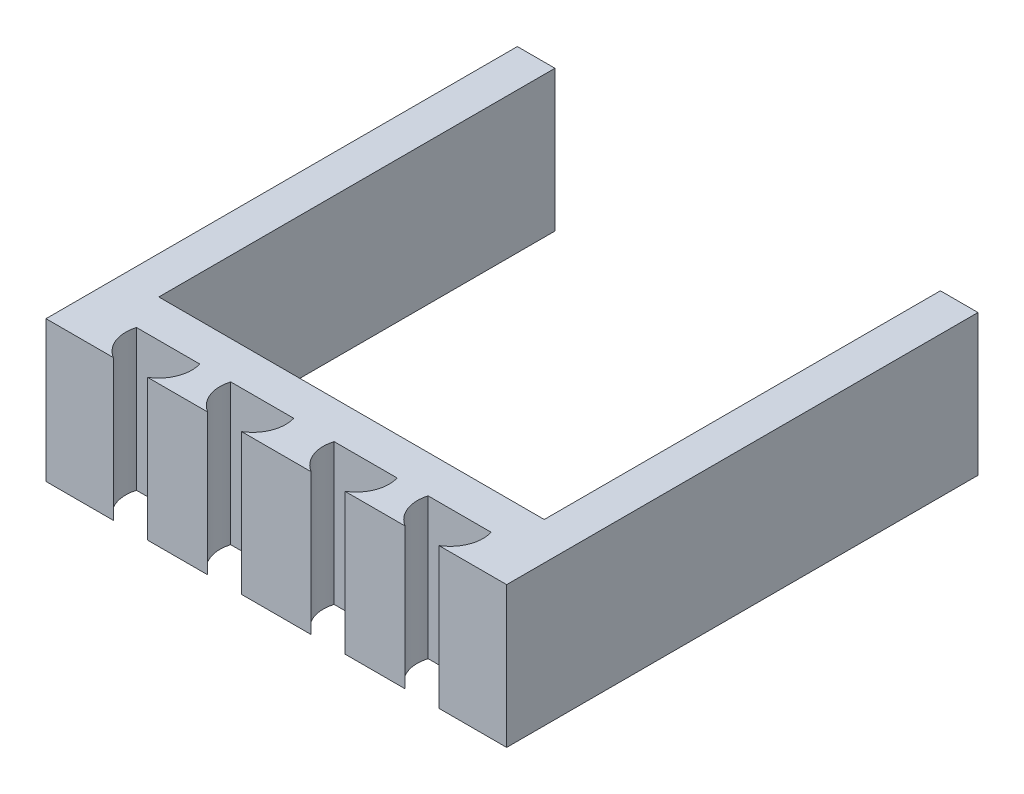
ISO-10303-21;
HEADER;
FILE_DESCRIPTION(('STEP AP214'),'2;1');
FILE_NAME('part.step','',(''),(''),'','','');
FILE_SCHEMA(('AUTOMOTIVE_DESIGN { 1 0 10303 214 1 1 1 1 }'));
ENDSEC;
DATA;
#1=APPLICATION_CONTEXT('core data for automotive mechanical design processes');
#2=APPLICATION_PROTOCOL_DEFINITION('international standard','automotive_design',2000,#1);
#3=PRODUCT_CONTEXT('',#1,'mechanical');
#4=PRODUCT('Part','Part','',(#3));
#5=PRODUCT_RELATED_PRODUCT_CATEGORY('part','',(#4));
#6=PRODUCT_DEFINITION_FORMATION('','',#4);
#7=PRODUCT_DEFINITION_CONTEXT('part definition',#1,'design');
#8=PRODUCT_DEFINITION('design','',#6,#7);
#9=PRODUCT_DEFINITION_SHAPE('','',#8);
#10=(LENGTH_UNIT() NAMED_UNIT(*) SI_UNIT(.MILLI.,.METRE.));
#11=(NAMED_UNIT(*) PLANE_ANGLE_UNIT() SI_UNIT($,.RADIAN.));
#12=(NAMED_UNIT(*) SI_UNIT($,.STERADIAN.) SOLID_ANGLE_UNIT());
#13=UNCERTAINTY_MEASURE_WITH_UNIT(LENGTH_MEASURE(1.E-05),#10,'distance_accuracy_value','');
#14=(GEOMETRIC_REPRESENTATION_CONTEXT(3) GLOBAL_UNCERTAINTY_ASSIGNED_CONTEXT((#13)) GLOBAL_UNIT_ASSIGNED_CONTEXT((#10,
#11,#12)) REPRESENTATION_CONTEXT('',''));
#15=CARTESIAN_POINT('',(0.,0.,0.));
#16=DIRECTION('',(0.,0.,1.));
#17=DIRECTION('',(1.,0.,0.));
#18=AXIS2_PLACEMENT_3D('',#15,#16,#17);
#19=CARTESIAN_POINT('',(24.3573085846868,15.,28.1102088167053));
#20=DIRECTION('',(0.,0.,-1.));
#21=DIRECTION('',(-1.,0.,0.));
#22=AXIS2_PLACEMENT_3D('',#19,#20,#21);
#23=PLANE('',#22);
#24=DIRECTION('',(1.,0.,0.));
#25=VECTOR('',#24,1.);
#26=CARTESIAN_POINT('',(24.3573085846868,0.,28.1102088167053));
#27=LINE('',#26,#25);
#28=CARTESIAN_POINT('',(2.00320661843708,0.,28.1102088167053));
#29=VERTEX_POINT('',#28);
#30=CARTESIAN_POINT('',(8.71141055093645,0.,28.1102088167053));
#31=VERTEX_POINT('',#30);
#32=EDGE_CURVE('E505',#29,#31,#27,.T.);
#33=ORIENTED_EDGE('',*,*,#32,.T.);
#34=DIRECTION('',(0.,-1.,0.));
#35=VECTOR('',#34,1.);
#36=CARTESIAN_POINT('',(8.71141055093645,15.,28.1102088167053));
#37=LINE('',#36,#35);
#38=CARTESIAN_POINT('',(8.71141055093645,15.,28.1102088167053));
#39=VERTEX_POINT('',#38);
#40=EDGE_CURVE('E293',#31,#39,#37,.F.);
#41=ORIENTED_EDGE('',*,*,#40,.T.);
#42=DIRECTION('',(1.,0.,0.));
#43=VECTOR('',#42,1.);
#44=CARTESIAN_POINT('',(24.3573085846868,15.,28.1102088167053));
#45=LINE('',#44,#43);
#46=CARTESIAN_POINT('',(2.00320661843708,15.,28.1102088167053));
#47=VERTEX_POINT('',#46);
#48=EDGE_CURVE('E482',#47,#39,#45,.T.);
#49=ORIENTED_EDGE('',*,*,#48,.F.);
#50=DIRECTION('',(0.,-1.,0.));
#51=VECTOR('',#50,1.);
#52=CARTESIAN_POINT('',(2.00320661843708,15.,28.1102088167053));
#53=LINE('',#52,#51);
#54=EDGE_CURVE('E334',#47,#29,#53,.T.);
#55=ORIENTED_EDGE('',*,*,#54,.T.);
#56=EDGE_LOOP('',(#33,#41,#49,#55));
#57=FACE_BOUND('',#56,.T.);
#58=ADVANCED_FACE('F39',(#57),#23,.F.);
#59=CARTESIAN_POINT('',(-8.99679338156291,0.,28.1102088167053));
#60=VERTEX_POINT('',#59);
#61=CARTESIAN_POINT('',(-2.28858944906354,0.,28.1102088167053));
#62=VERTEX_POINT('',#61);
#63=EDGE_CURVE('E416',#60,#62,#27,.T.);
#64=ORIENTED_EDGE('',*,*,#63,.T.);
#65=DIRECTION('',(0.,-1.,0.));
#66=VECTOR('',#65,1.);
#67=CARTESIAN_POINT('',(-2.28858944906355,15.,28.1102088167053));
#68=LINE('',#67,#66);
#69=CARTESIAN_POINT('',(-2.28858944906354,15.,28.1102088167053));
#70=VERTEX_POINT('',#69);
#71=EDGE_CURVE('E316',#70,#62,#68,.T.);
#72=ORIENTED_EDGE('',*,*,#71,.F.);
#73=CARTESIAN_POINT('',(-8.99679338156291,15.,28.1102088167053));
#74=VERTEX_POINT('',#73);
#75=EDGE_CURVE('E389',#74,#70,#45,.T.);
#76=ORIENTED_EDGE('',*,*,#75,.F.);
#77=DIRECTION('',(0.,-1.,0.));
#78=VECTOR('',#77,1.);
#79=CARTESIAN_POINT('',(-8.99679338156291,15.,28.1102088167053));
#80=LINE('',#79,#78);
#81=EDGE_CURVE('E365',#74,#60,#80,.T.);
#82=ORIENTED_EDGE('',*,*,#81,.T.);
#83=EDGE_LOOP('',(#64,#72,#76,#82));
#84=FACE_BOUND('',#83,.T.);
#85=ADVANCED_FACE('F521',(#84),#23,.F.);
#86=CARTESIAN_POINT('',(-19.0189296038567,15.,28.1102088167053));
#87=VERTEX_POINT('',#86);
#88=CARTESIAN_POINT('',(-12.2885894490635,15.,28.1102088167053));
#89=VERTEX_POINT('',#88);
#90=EDGE_CURVE('E55',#87,#89,#45,.T.);
#91=ORIENTED_EDGE('',*,*,#90,.F.);
#92=DIRECTION('',(0.,-1.,0.));
#93=VECTOR('',#92,1.);
#94=CARTESIAN_POINT('',(-19.0189296038567,15.,28.1102088167053));
#95=LINE('',#94,#93);
#96=CARTESIAN_POINT('',(-19.0189296038567,0.,28.1102088167053));
#97=VERTEX_POINT('',#96);
#98=EDGE_CURVE('E215',#87,#97,#95,.T.);
#99=ORIENTED_EDGE('',*,*,#98,.T.);
#100=CARTESIAN_POINT('',(-12.2885894490635,0.,28.1102088167053));
#101=VERTEX_POINT('',#100);
#102=EDGE_CURVE('E412',#97,#101,#27,.T.);
#103=ORIENTED_EDGE('',*,*,#102,.T.);
#104=DIRECTION('',(0.,-1.,0.));
#105=VECTOR('',#104,1.);
#106=CARTESIAN_POINT('',(-12.2885894490635,15.,28.1102088167053));
#107=LINE('',#106,#105);
#108=EDGE_CURVE('E370',#89,#101,#107,.T.);
#109=ORIENTED_EDGE('',*,*,#108,.F.);
#110=EDGE_LOOP('',(#91,#99,#103,#109));
#111=FACE_BOUND('',#110,.T.);
#112=ADVANCED_FACE('F531',(#111),#23,.F.);
#113=CARTESIAN_POINT('',(-24.6426914153132,15.,-18.0266821345708));
#114=DIRECTION('',(0.,0.,1.));
#115=DIRECTION('',(1.,0.,0.));
#116=AXIS2_PLACEMENT_3D('',#113,#114,#115);
#117=PLANE('',#116);
#118=DIRECTION('',(-1.,0.,0.));
#119=VECTOR('',#118,1.);
#120=CARTESIAN_POINT('',(-24.6426914153132,0.,-18.0266821345708));
#121=LINE('',#120,#119);
#122=CARTESIAN_POINT('',(-20.6426914153132,0.,-18.0266821345708));
#123=VERTEX_POINT('',#122);
#124=CARTESIAN_POINT('',(-24.6426914153132,0.,-18.0266821345708));
#125=VERTEX_POINT('',#124);
#126=EDGE_CURVE('E369',#123,#125,#121,.T.);
#127=ORIENTED_EDGE('',*,*,#126,.T.);
#128=DIRECTION('',(0.,-1.,0.));
#129=VECTOR('',#128,1.);
#130=CARTESIAN_POINT('',(-24.6426914153132,15.,-18.0266821345708));
#131=LINE('',#130,#129);
#132=CARTESIAN_POINT('',(-24.6426914153132,15.,-18.0266821345708));
#133=VERTEX_POINT('',#132);
#134=EDGE_CURVE('E11',#133,#125,#131,.T.);
#135=ORIENTED_EDGE('',*,*,#134,.F.);
#136=DIRECTION('',(-1.,0.,0.));
#137=VECTOR('',#136,1.);
#138=CARTESIAN_POINT('',(-24.6426914153132,15.,-18.0266821345708));
#139=LINE('',#138,#137);
#140=CARTESIAN_POINT('',(-20.6426914153132,15.,-18.0266821345708));
#141=VERTEX_POINT('',#140);
#142=EDGE_CURVE('E379',#141,#133,#139,.T.);
#143=ORIENTED_EDGE('',*,*,#142,.F.);
#144=DIRECTION('',(0.,-1.,0.));
#145=VECTOR('',#144,1.);
#146=CARTESIAN_POINT('',(-20.6426914153132,15.,-18.0266821345708));
#147=LINE('',#146,#145);
#148=EDGE_CURVE('E404',#141,#123,#147,.T.);
#149=ORIENTED_EDGE('',*,*,#148,.T.);
#150=EDGE_LOOP('',(#127,#135,#143,#149));
#151=FACE_BOUND('',#150,.T.);
#152=ADVANCED_FACE('F41',(#151),#117,.F.);
#153=CARTESIAN_POINT('',(-24.6426914153132,15.,28.1102088167053));
#154=DIRECTION('',(1.,0.,0.));
#155=DIRECTION('',(0.,0.,-1.));
#156=AXIS2_PLACEMENT_3D('',#153,#154,#155);
#157=PLANE('',#156);
#158=DIRECTION('',(0.,0.,1.));
#159=VECTOR('',#158,1.);
#160=CARTESIAN_POINT('',(-24.6426914153132,0.,28.1102088167053));
#161=LINE('',#160,#159);
#162=CARTESIAN_POINT('',(-24.6426914153132,0.,32.1102088167053));
#163=VERTEX_POINT('',#162);
#164=EDGE_CURVE('E408',#125,#163,#161,.T.);
#165=ORIENTED_EDGE('',*,*,#164,.T.);
#166=DIRECTION('',(0.,-1.,0.));
#167=VECTOR('',#166,1.);
#168=CARTESIAN_POINT('',(-24.6426914153132,15.,32.1102088167053));
#169=LINE('',#168,#167);
#170=CARTESIAN_POINT('',(-24.6426914153132,15.,32.1102088167053));
#171=VERTEX_POINT('',#170);
#172=EDGE_CURVE('E214',#171,#163,#169,.T.);
#173=ORIENTED_EDGE('',*,*,#172,.F.);
#174=DIRECTION('',(0.,0.,1.));
#175=VECTOR('',#174,1.);
#176=CARTESIAN_POINT('',(-24.6426914153132,15.,28.1102088167053));
#177=LINE('',#176,#175);
#178=EDGE_CURVE('E223',#133,#171,#177,.T.);
#179=ORIENTED_EDGE('',*,*,#178,.F.);
#180=ORIENTED_EDGE('',*,*,#134,.T.);
#181=EDGE_LOOP('',(#165,#173,#179,#180));
#182=FACE_BOUND('',#181,.T.);
#183=ADVANCED_FACE('F538',(#182),#157,.F.);
#184=CARTESIAN_POINT('',(12.0032066184371,0.,28.1102088167053));
#185=VERTEX_POINT('',#184);
#186=CARTESIAN_POINT('',(18.7114105509365,0.,28.1102088167053));
#187=VERTEX_POINT('',#186);
#188=EDGE_CURVE('E411',#185,#187,#27,.T.);
#189=ORIENTED_EDGE('',*,*,#188,.T.);
#190=DIRECTION('',(0.,-1.,0.));
#191=VECTOR('',#190,1.);
#192=CARTESIAN_POINT('',(18.7114105509365,15.,28.1102088167053));
#193=LINE('',#192,#191);
#194=CARTESIAN_POINT('',(18.7114105509365,15.,28.1102088167053));
#195=VERTEX_POINT('',#194);
#196=EDGE_CURVE('E63',#195,#187,#193,.T.);
#197=ORIENTED_EDGE('',*,*,#196,.F.);
#198=CARTESIAN_POINT('',(12.0032066186796,15.,28.1102088167056));
#199=VERTEX_POINT('',#198);
#200=EDGE_CURVE('E385',#199,#195,#45,.T.);
#201=ORIENTED_EDGE('',*,*,#200,.F.);
#202=DIRECTION('',(0.,-1.,0.));
#203=VECTOR('',#202,1.);
#204=CARTESIAN_POINT('',(12.0032066184371,15.,28.1102088167053));
#205=LINE('',#204,#203);
#206=EDGE_CURVE('E279',#199,#185,#205,.T.);
#207=ORIENTED_EDGE('',*,*,#206,.T.);
#208=EDGE_LOOP('',(#189,#197,#201,#207));
#209=FACE_BOUND('',#208,.T.);
#210=ADVANCED_FACE('F516',(#209),#23,.F.);
#211=CARTESIAN_POINT('',(24.3573085846868,15.,-18.0266821345708));
#212=DIRECTION('',(-1.,0.,0.));
#213=DIRECTION('',(0.,0.,1.));
#214=AXIS2_PLACEMENT_3D('',#211,#212,#213);
#215=PLANE('',#214);
#216=DIRECTION('',(0.,0.,-1.));
#217=VECTOR('',#216,1.);
#218=CARTESIAN_POINT('',(24.3573085846868,0.,-18.0266821345708));
#219=LINE('',#218,#217);
#220=CARTESIAN_POINT('',(24.3573085846868,0.,32.1102088167053));
#221=VERTEX_POINT('',#220);
#222=CARTESIAN_POINT('',(24.3573085846868,0.,-18.0266821345708));
#223=VERTEX_POINT('',#222);
#224=EDGE_CURVE('E415',#221,#223,#219,.T.);
#225=ORIENTED_EDGE('',*,*,#224,.T.);
#226=DIRECTION('',(0.,-1.,0.));
#227=VECTOR('',#226,1.);
#228=CARTESIAN_POINT('',(24.3573085846868,15.,-18.0266821345708));
#229=LINE('',#228,#227);
#230=CARTESIAN_POINT('',(24.3573085846868,15.,-18.0266821345708));
#231=VERTEX_POINT('',#230);
#232=EDGE_CURVE('E48',#231,#223,#229,.T.);
#233=ORIENTED_EDGE('',*,*,#232,.F.);
#234=DIRECTION('',(0.,0.,-1.));
#235=VECTOR('',#234,1.);
#236=CARTESIAN_POINT('',(24.3573085846868,15.,-18.0266821345708));
#237=LINE('',#236,#235);
#238=CARTESIAN_POINT('',(24.3573085846868,15.,32.1102088167053));
#239=VERTEX_POINT('',#238);
#240=EDGE_CURVE('E388',#239,#231,#237,.T.);
#241=ORIENTED_EDGE('',*,*,#240,.F.);
#242=DIRECTION('',(0.,-1.,0.));
#243=VECTOR('',#242,1.);
#244=CARTESIAN_POINT('',(24.3573085846868,15.,32.1102088167053));
#245=LINE('',#244,#243);
#246=EDGE_CURVE('E260',#239,#221,#245,.T.);
#247=ORIENTED_EDGE('',*,*,#246,.T.);
#248=EDGE_LOOP('',(#225,#233,#241,#247));
#249=FACE_BOUND('',#248,.T.);
#250=ADVANCED_FACE('F471',(#249),#215,.F.);
#251=CARTESIAN_POINT('',(20.3573085846868,15.,-18.0266821345708));
#252=DIRECTION('',(0.,0.,1.));
#253=DIRECTION('',(1.,0.,0.));
#254=AXIS2_PLACEMENT_3D('',#251,#252,#253);
#255=PLANE('',#254);
#256=DIRECTION('',(-1.,0.,0.));
#257=VECTOR('',#256,1.);
#258=CARTESIAN_POINT('',(20.3573085846868,0.,-18.0266821345708));
#259=LINE('',#258,#257);
#260=CARTESIAN_POINT('',(20.3573085846868,0.,-18.0266821345708));
#261=VERTEX_POINT('',#260);
#262=EDGE_CURVE('E419',#223,#261,#259,.T.);
#263=ORIENTED_EDGE('',*,*,#262,.T.);
#264=DIRECTION('',(0.,-1.,0.));
#265=VECTOR('',#264,1.);
#266=CARTESIAN_POINT('',(20.3573085846868,15.,-18.0266821345708));
#267=LINE('',#266,#265);
#268=CARTESIAN_POINT('',(20.3573085846868,15.,-18.0266821345708));
#269=VERTEX_POINT('',#268);
#270=EDGE_CURVE('E441',#269,#261,#267,.T.);
#271=ORIENTED_EDGE('',*,*,#270,.F.);
#272=DIRECTION('',(-1.,0.,0.));
#273=VECTOR('',#272,1.);
#274=CARTESIAN_POINT('',(20.3573085846868,15.,-18.0266821345708));
#275=LINE('',#274,#273);
#276=EDGE_CURVE('E392',#231,#269,#275,.T.);
#277=ORIENTED_EDGE('',*,*,#276,.F.);
#278=ORIENTED_EDGE('',*,*,#232,.T.);
#279=EDGE_LOOP('',(#263,#271,#277,#278));
#280=FACE_BOUND('',#279,.T.);
#281=ADVANCED_FACE('F450',(#280),#255,.F.);
#282=CARTESIAN_POINT('',(20.3573085846868,15.,24.1102088167053));
#283=DIRECTION('',(1.,0.,0.));
#284=DIRECTION('',(0.,0.,-1.));
#285=AXIS2_PLACEMENT_3D('',#282,#283,#284);
#286=PLANE('',#285);
#287=DIRECTION('',(0.,0.,1.));
#288=VECTOR('',#287,1.);
#289=CARTESIAN_POINT('',(20.3573085846868,0.,24.1102088167053));
#290=LINE('',#289,#288);
#291=CARTESIAN_POINT('',(20.3573085846868,0.,24.1102088167053));
#292=VERTEX_POINT('',#291);
#293=EDGE_CURVE('E422',#261,#292,#290,.T.);
#294=ORIENTED_EDGE('',*,*,#293,.T.);
#295=DIRECTION('',(0.,-1.,0.));
#296=VECTOR('',#295,1.);
#297=CARTESIAN_POINT('',(20.3573085846868,15.,24.1102088167053));
#298=LINE('',#297,#296);
#299=CARTESIAN_POINT('',(20.3573085846868,15.,24.1102088167053));
#300=VERTEX_POINT('',#299);
#301=EDGE_CURVE('E437',#300,#292,#298,.T.);
#302=ORIENTED_EDGE('',*,*,#301,.F.);
#303=DIRECTION('',(0.,0.,1.));
#304=VECTOR('',#303,1.);
#305=CARTESIAN_POINT('',(20.3573085846868,15.,24.1102088167053));
#306=LINE('',#305,#304);
#307=EDGE_CURVE('E395',#269,#300,#306,.T.);
#308=ORIENTED_EDGE('',*,*,#307,.F.);
#309=ORIENTED_EDGE('',*,*,#270,.T.);
#310=EDGE_LOOP('',(#294,#302,#308,#309));
#311=FACE_BOUND('',#310,.T.);
#312=ADVANCED_FACE('F460',(#311),#286,.F.);
#313=CARTESIAN_POINT('',(-20.6426914153132,15.,24.1102088167053));
#314=DIRECTION('',(0.,0.,1.));
#315=DIRECTION('',(1.,0.,0.));
#316=AXIS2_PLACEMENT_3D('',#313,#314,#315);
#317=PLANE('',#316);
#318=DIRECTION('',(-1.,0.,0.));
#319=VECTOR('',#318,1.);
#320=CARTESIAN_POINT('',(-20.6426914153132,0.,24.1102088167053));
#321=LINE('',#320,#319);
#322=CARTESIAN_POINT('',(-20.6426914153132,0.,24.1102088167053));
#323=VERTEX_POINT('',#322);
#324=EDGE_CURVE('E425',#292,#323,#321,.T.);
#325=ORIENTED_EDGE('',*,*,#324,.T.);
#326=DIRECTION('',(0.,-1.,0.));
#327=VECTOR('',#326,1.);
#328=CARTESIAN_POINT('',(-20.6426914153132,15.,24.1102088167053));
#329=LINE('',#328,#327);
#330=CARTESIAN_POINT('',(-20.6426914153132,15.,24.1102088167053));
#331=VERTEX_POINT('',#330);
#332=EDGE_CURVE('E433',#331,#323,#329,.T.);
#333=ORIENTED_EDGE('',*,*,#332,.F.);
#334=DIRECTION('',(-1.,0.,0.));
#335=VECTOR('',#334,1.);
#336=CARTESIAN_POINT('',(-20.6426914153132,15.,24.1102088167053));
#337=LINE('',#336,#335);
#338=EDGE_CURVE('E398',#300,#331,#337,.T.);
#339=ORIENTED_EDGE('',*,*,#338,.F.);
#340=ORIENTED_EDGE('',*,*,#301,.T.);
#341=EDGE_LOOP('',(#325,#333,#339,#340));
#342=FACE_BOUND('',#341,.T.);
#343=ADVANCED_FACE('F464',(#342),#317,.F.);
#344=CARTESIAN_POINT('',(-20.6426914153132,15.,-18.0266821345708));
#345=DIRECTION('',(-1.,0.,0.));
#346=DIRECTION('',(0.,0.,1.));
#347=AXIS2_PLACEMENT_3D('',#344,#345,#346);
#348=PLANE('',#347);
#349=DIRECTION('',(0.,0.,-1.));
#350=VECTOR('',#349,1.);
#351=CARTESIAN_POINT('',(-20.6426914153132,0.,-18.0266821345708));
#352=LINE('',#351,#350);
#353=EDGE_CURVE('E382',#323,#123,#352,.T.);
#354=ORIENTED_EDGE('',*,*,#353,.T.);
#355=ORIENTED_EDGE('',*,*,#148,.F.);
#356=DIRECTION('',(0.,0.,-1.));
#357=VECTOR('',#356,1.);
#358=CARTESIAN_POINT('',(-20.6426914153132,15.,-18.0266821345708));
#359=LINE('',#358,#357);
#360=EDGE_CURVE('E401',#331,#141,#359,.T.);
#361=ORIENTED_EDGE('',*,*,#360,.F.);
#362=ORIENTED_EDGE('',*,*,#332,.T.);
#363=EDGE_LOOP('',(#354,#355,#361,#362));
#364=FACE_BOUND('',#363,.T.);
#365=ADVANCED_FACE('F589',(#364),#348,.F.);
#366=CARTESIAN_POINT('',(0.,15.,0.));
#367=DIRECTION('',(0.,-1.,0.));
#368=DIRECTION('',(0.,0.,-1.));
#369=AXIS2_PLACEMENT_3D('',#366,#367,#368);
#370=PLANE('',#369);
#371=ORIENTED_EDGE('',*,*,#48,.T.);
#372=CARTESIAN_POINT('',(5.35730858468677,15.,29.1102088167053));
#373=DIRECTION('',(0.,1.,0.));
#374=DIRECTION('',(0.,0.,1.));
#375=AXIS2_PLACEMENT_3D('',#372,#373,#374);
#376=CIRCLE('',#375,3.5);
#377=CARTESIAN_POINT('',(7.16008422241877,15.,32.1102088167053));
#378=VERTEX_POINT('',#377);
#379=EDGE_CURVE('E266',#378,#39,#376,.T.);
#380=ORIENTED_EDGE('',*,*,#379,.F.);
#381=DIRECTION('',(-1.,0.,0.));
#382=VECTOR('',#381,1.);
#383=CARTESIAN_POINT('',(7.16008422241877,15.,32.1102088167053));
#384=LINE('',#383,#382);
#385=CARTESIAN_POINT('',(13.5545329469548,15.,32.1102088167053));
#386=VERTEX_POINT('',#385);
#387=EDGE_CURVE('E275',#386,#378,#384,.T.);
#388=ORIENTED_EDGE('',*,*,#387,.F.);
#389=CARTESIAN_POINT('',(15.3573085846868,15.,29.1102088167053));
#390=DIRECTION('',(0.,1.,0.));
#391=DIRECTION('',(0.,0.,1.));
#392=AXIS2_PLACEMENT_3D('',#389,#390,#391);
#393=CIRCLE('',#392,3.5);
#394=EDGE_CURVE('E270',#199,#386,#393,.T.);
#395=ORIENTED_EDGE('',*,*,#394,.F.);
#396=ORIENTED_EDGE('',*,*,#200,.T.);
#397=CARTESIAN_POINT('',(15.3573085846868,15.,29.1102088167053));
#398=DIRECTION('',(0.,1.,0.));
#399=DIRECTION('',(0.,0.,-1.));
#400=AXIS2_PLACEMENT_3D('',#397,#398,#399);
#401=CIRCLE('',#400,3.50000000000001);
#402=CARTESIAN_POINT('',(17.1600842224188,15.,32.1102088167053));
#403=VERTEX_POINT('',#402);
#404=EDGE_CURVE('E241',#403,#195,#401,.T.);
#405=ORIENTED_EDGE('',*,*,#404,.F.);
#406=DIRECTION('',(-1.,0.,0.));
#407=VECTOR('',#406,1.);
#408=CARTESIAN_POINT('',(17.1600842224188,15.,32.1102088167053));
#409=LINE('',#408,#407);
#410=EDGE_CURVE('E245',#239,#403,#409,.T.);
#411=ORIENTED_EDGE('',*,*,#410,.F.);
#412=ORIENTED_EDGE('',*,*,#240,.T.);
#413=ORIENTED_EDGE('',*,*,#276,.T.);
#414=ORIENTED_EDGE('',*,*,#307,.T.);
#415=ORIENTED_EDGE('',*,*,#338,.T.);
#416=ORIENTED_EDGE('',*,*,#360,.T.);
#417=ORIENTED_EDGE('',*,*,#142,.T.);
#418=ORIENTED_EDGE('',*,*,#178,.T.);
#419=DIRECTION('',(-1.,0.,0.));
#420=VECTOR('',#419,1.);
#421=CARTESIAN_POINT('',(-24.6426914153132,15.,32.1102088167053));
#422=LINE('',#421,#420);
#423=CARTESIAN_POINT('',(-17.4863248674342,15.,32.1102088167053));
#424=VERTEX_POINT('',#423);
#425=EDGE_CURVE('E206',#424,#171,#422,.T.);
#426=ORIENTED_EDGE('',*,*,#425,.F.);
#427=CARTESIAN_POINT('',(-15.6426914153132,15.,29.1102088167053));
#428=DIRECTION('',(0.,1.,0.));
#429=DIRECTION('',(0.,0.,-1.));
#430=AXIS2_PLACEMENT_3D('',#427,#428,#429);
#431=CIRCLE('',#430,3.52121915049026);
#432=EDGE_CURVE('E221',#87,#424,#431,.T.);
#433=ORIENTED_EDGE('',*,*,#432,.F.);
#434=ORIENTED_EDGE('',*,*,#90,.T.);
#435=CARTESIAN_POINT('',(-15.6426914153132,15.,29.1102088167053));
#436=DIRECTION('',(0.,1.,0.));
#437=DIRECTION('',(0.,0.,1.));
#438=AXIS2_PLACEMENT_3D('',#435,#436,#437);
#439=CIRCLE('',#438,3.5);
#440=CARTESIAN_POINT('',(-13.8399157775812,15.,32.1102088167053));
#441=VERTEX_POINT('',#440);
#442=EDGE_CURVE('E350',#441,#89,#439,.T.);
#443=ORIENTED_EDGE('',*,*,#442,.F.);
#444=DIRECTION('',(-1.,0.,0.));
#445=VECTOR('',#444,1.);
#446=CARTESIAN_POINT('',(-13.8399157775812,15.,32.1102088167053));
#447=LINE('',#446,#445);
#448=CARTESIAN_POINT('',(-7.44546705304523,15.,32.1102088167053));
#449=VERTEX_POINT('',#448);
#450=EDGE_CURVE('E345',#449,#441,#447,.T.);
#451=ORIENTED_EDGE('',*,*,#450,.F.);
#452=CARTESIAN_POINT('',(-5.64269141531323,15.,29.1102088167053));
#453=DIRECTION('',(0.,1.,0.));
#454=DIRECTION('',(0.,0.,1.));
#455=AXIS2_PLACEMENT_3D('',#452,#453,#454);
#456=CIRCLE('',#455,3.5);
#457=EDGE_CURVE('E341',#74,#449,#456,.T.);
#458=ORIENTED_EDGE('',*,*,#457,.F.);
#459=ORIENTED_EDGE('',*,*,#75,.T.);
#460=CARTESIAN_POINT('',(-5.64269141531323,15.,29.1102088167053));
#461=DIRECTION('',(0.,1.,0.));
#462=DIRECTION('',(0.,0.,1.));
#463=AXIS2_PLACEMENT_3D('',#460,#461,#462);
#464=CIRCLE('',#463,3.5);
#465=CARTESIAN_POINT('',(-3.83991577758123,15.,32.1102088167053));
#466=VERTEX_POINT('',#465);
#467=EDGE_CURVE('E303',#466,#70,#464,.T.);
#468=ORIENTED_EDGE('',*,*,#467,.F.);
#469=DIRECTION('',(-1.,0.,0.));
#470=VECTOR('',#469,1.);
#471=CARTESIAN_POINT('',(-3.83991577758123,15.,32.1102088167053));
#472=LINE('',#471,#470);
#473=CARTESIAN_POINT('',(3.55453294695477,15.,32.1102088167053));
#474=VERTEX_POINT('',#473);
#475=EDGE_CURVE('E312',#474,#466,#472,.T.);
#476=ORIENTED_EDGE('',*,*,#475,.F.);
#477=CARTESIAN_POINT('',(5.35730858468677,15.,29.1102088167053));
#478=DIRECTION('',(0.,1.,0.));
#479=DIRECTION('',(0.,0.,-1.));
#480=AXIS2_PLACEMENT_3D('',#477,#478,#479);
#481=CIRCLE('',#480,3.5);
#482=EDGE_CURVE('E307',#47,#474,#481,.T.);
#483=ORIENTED_EDGE('',*,*,#482,.F.);
#484=EDGE_LOOP('',(#371,#380,#388,#395,#396,#405,#411,#412,#413,#414,#415,#416,#417,#418,#426,
#433,#434,#443,#451,#458,#459,#468,#476,#483));
#485=FACE_BOUND('',#484,.T.);
#486=ADVANCED_FACE('F220',(#485),#370,.F.);
#487=CARTESIAN_POINT('',(0.,0.,0.));
#488=DIRECTION('',(0.,-1.,0.));
#489=DIRECTION('',(0.,0.,-1.));
#490=AXIS2_PLACEMENT_3D('',#487,#488,#489);
#491=PLANE('',#490);
#492=ORIENTED_EDGE('',*,*,#188,.F.);
#493=CARTESIAN_POINT('',(15.3573085846868,0.,29.1102088167053));
#494=DIRECTION('',(0.,1.,0.));
#495=DIRECTION('',(0.,0.,1.));
#496=AXIS2_PLACEMENT_3D('',#493,#494,#495);
#497=CIRCLE('',#496,3.5);
#498=CARTESIAN_POINT('',(13.5545329469548,0.,32.1102088167053));
#499=VERTEX_POINT('',#498);
#500=EDGE_CURVE('E283',#185,#499,#497,.T.);
#501=ORIENTED_EDGE('',*,*,#500,.T.);
#502=DIRECTION('',(-1.,0.,0.));
#503=VECTOR('',#502,1.);
#504=CARTESIAN_POINT('',(7.16008422241877,0.,32.1102088167053));
#505=LINE('',#504,#503);
#506=CARTESIAN_POINT('',(7.16008422241877,0.,32.1102088167053));
#507=VERTEX_POINT('',#506);
#508=EDGE_CURVE('E271',#499,#507,#505,.T.);
#509=ORIENTED_EDGE('',*,*,#508,.T.);
#510=CARTESIAN_POINT('',(5.35730858468677,0.,29.1102088167053));
#511=DIRECTION('',(0.,1.,0.));
#512=DIRECTION('',(0.,0.,1.));
#513=AXIS2_PLACEMENT_3D('',#510,#511,#512);
#514=CIRCLE('',#513,3.5);
#515=EDGE_CURVE('E259',#507,#31,#514,.T.);
#516=ORIENTED_EDGE('',*,*,#515,.T.);
#517=ORIENTED_EDGE('',*,*,#32,.F.);
#518=CARTESIAN_POINT('',(5.35730858468677,0.,29.1102088167053));
#519=DIRECTION('',(0.,1.,0.));
#520=DIRECTION('',(0.,0.,-1.));
#521=AXIS2_PLACEMENT_3D('',#518,#519,#520);
#522=CIRCLE('',#521,3.5);
#523=CARTESIAN_POINT('',(3.55453294695477,0.,32.1102088167053));
#524=VERTEX_POINT('',#523);
#525=EDGE_CURVE('E320',#29,#524,#522,.T.);
#526=ORIENTED_EDGE('',*,*,#525,.T.);
#527=DIRECTION('',(-1.,0.,0.));
#528=VECTOR('',#527,1.);
#529=CARTESIAN_POINT('',(-3.83991577758123,0.,32.1102088167053));
#530=LINE('',#529,#528);
#531=CARTESIAN_POINT('',(-3.83991577758123,0.,32.1102088167053));
#532=VERTEX_POINT('',#531);
#533=EDGE_CURVE('E308',#524,#532,#530,.T.);
#534=ORIENTED_EDGE('',*,*,#533,.T.);
#535=CARTESIAN_POINT('',(-5.64269141531323,0.,29.1102088167053));
#536=DIRECTION('',(0.,1.,0.));
#537=DIRECTION('',(0.,0.,1.));
#538=AXIS2_PLACEMENT_3D('',#535,#536,#537);
#539=CIRCLE('',#538,3.5);
#540=EDGE_CURVE('E302',#532,#62,#539,.T.);
#541=ORIENTED_EDGE('',*,*,#540,.T.);
#542=ORIENTED_EDGE('',*,*,#63,.F.);
#543=CARTESIAN_POINT('',(-5.64269141531323,0.,29.1102088167053));
#544=DIRECTION('',(0.,1.,0.));
#545=DIRECTION('',(0.,0.,1.));
#546=AXIS2_PLACEMENT_3D('',#543,#544,#545);
#547=CIRCLE('',#546,3.5);
#548=CARTESIAN_POINT('',(-7.44546705304523,0.,32.1102088167053));
#549=VERTEX_POINT('',#548);
#550=EDGE_CURVE('E330',#60,#549,#547,.T.);
#551=ORIENTED_EDGE('',*,*,#550,.T.);
#552=DIRECTION('',(-1.,0.,0.));
#553=VECTOR('',#552,1.);
#554=CARTESIAN_POINT('',(-13.8399157775812,0.,32.1102088167053));
#555=LINE('',#554,#553);
#556=CARTESIAN_POINT('',(-13.8399157775812,0.,32.1102088167053));
#557=VERTEX_POINT('',#556);
#558=EDGE_CURVE('E358',#549,#557,#555,.T.);
#559=ORIENTED_EDGE('',*,*,#558,.T.);
#560=CARTESIAN_POINT('',(-15.6426914153132,0.,29.1102088167053));
#561=DIRECTION('',(0.,1.,0.));
#562=DIRECTION('',(0.,0.,1.));
#563=AXIS2_PLACEMENT_3D('',#560,#561,#562);
#564=CIRCLE('',#563,3.5);
#565=EDGE_CURVE('E346',#557,#101,#564,.T.);
#566=ORIENTED_EDGE('',*,*,#565,.T.);
#567=ORIENTED_EDGE('',*,*,#102,.F.);
#568=CARTESIAN_POINT('',(-15.6426914153132,0.,29.1102088167053));
#569=DIRECTION('',(0.,1.,0.));
#570=DIRECTION('',(0.,0.,-1.));
#571=AXIS2_PLACEMENT_3D('',#568,#569,#570);
#572=CIRCLE('',#571,3.52121915049026);
#573=CARTESIAN_POINT('',(-17.4863248674342,0.,32.1102088167053));
#574=VERTEX_POINT('',#573);
#575=EDGE_CURVE('E231',#97,#574,#572,.T.);
#576=ORIENTED_EDGE('',*,*,#575,.T.);
#577=DIRECTION('',(-1.,0.,0.));
#578=VECTOR('',#577,1.);
#579=CARTESIAN_POINT('',(-24.6426914153132,0.,32.1102088167053));
#580=LINE('',#579,#578);
#581=EDGE_CURVE('E208',#574,#163,#580,.T.);
#582=ORIENTED_EDGE('',*,*,#581,.T.);
#583=ORIENTED_EDGE('',*,*,#164,.F.);
#584=ORIENTED_EDGE('',*,*,#126,.F.);
#585=ORIENTED_EDGE('',*,*,#353,.F.);
#586=ORIENTED_EDGE('',*,*,#324,.F.);
#587=ORIENTED_EDGE('',*,*,#293,.F.);
#588=ORIENTED_EDGE('',*,*,#262,.F.);
#589=ORIENTED_EDGE('',*,*,#224,.F.);
#590=DIRECTION('',(-1.,0.,0.));
#591=VECTOR('',#590,1.);
#592=CARTESIAN_POINT('',(17.1600842224188,0.,32.1102088167053));
#593=LINE('',#592,#591);
#594=CARTESIAN_POINT('',(17.1600842224188,0.,32.1102088167053));
#595=VERTEX_POINT('',#594);
#596=EDGE_CURVE('E246',#221,#595,#593,.T.);
#597=ORIENTED_EDGE('',*,*,#596,.T.);
#598=CARTESIAN_POINT('',(15.3573085846868,0.,29.1102088167053));
#599=DIRECTION('',(0.,1.,0.));
#600=DIRECTION('',(0.,0.,-1.));
#601=AXIS2_PLACEMENT_3D('',#598,#599,#600);
#602=CIRCLE('',#601,3.50000000000001);
#603=EDGE_CURVE('E237',#595,#187,#602,.T.);
#604=ORIENTED_EDGE('',*,*,#603,.T.);
#605=EDGE_LOOP('',(#492,#501,#509,#516,#517,#526,#534,#541,#542,#551,#559,#566,#567,#576,#582,
#583,#584,#585,#586,#587,#588,#589,#597,#604));
#606=FACE_BOUND('',#605,.T.);
#607=ADVANCED_FACE('F455',(#606),#491,.T.);
#608=CARTESIAN_POINT('',(-5.64269141531323,15.,29.1102088167053));
#609=DIRECTION('',(0.,-1.,0.));
#610=DIRECTION('',(0.,0.,-1.));
#611=AXIS2_PLACEMENT_3D('',#608,#609,#610);
#612=CYLINDRICAL_SURFACE('',#611,3.5);
#613=ORIENTED_EDGE('',*,*,#550,.F.);
#614=ORIENTED_EDGE('',*,*,#81,.F.);
#615=ORIENTED_EDGE('',*,*,#457,.T.);
#616=DIRECTION('',(0.,-1.,0.));
#617=VECTOR('',#616,1.);
#618=CARTESIAN_POINT('',(-7.44546705304523,15.,32.1102088167053));
#619=LINE('',#618,#617);
#620=EDGE_CURVE('E354',#449,#549,#619,.T.);
#621=ORIENTED_EDGE('',*,*,#620,.T.);
#622=EDGE_LOOP('',(#613,#614,#615,#621));
#623=FACE_BOUND('',#622,.T.);
#624=ADVANCED_FACE('F524',(#623),#612,.F.);
#625=CARTESIAN_POINT('',(-15.6426914153132,15.,29.1102088167053));
#626=DIRECTION('',(0.,-1.,0.));
#627=DIRECTION('',(0.,0.,-1.));
#628=AXIS2_PLACEMENT_3D('',#625,#626,#627);
#629=CYLINDRICAL_SURFACE('',#628,3.5);
#630=ORIENTED_EDGE('',*,*,#565,.F.);
#631=DIRECTION('',(0.,-1.,0.));
#632=VECTOR('',#631,1.);
#633=CARTESIAN_POINT('',(-13.8399157775812,15.,32.1102088167053));
#634=LINE('',#633,#632);
#635=EDGE_CURVE('E374',#441,#557,#634,.T.);
#636=ORIENTED_EDGE('',*,*,#635,.F.);
#637=ORIENTED_EDGE('',*,*,#442,.T.);
#638=ORIENTED_EDGE('',*,*,#108,.T.);
#639=EDGE_LOOP('',(#630,#636,#637,#638));
#640=FACE_BOUND('',#639,.T.);
#641=ADVANCED_FACE('F530',(#640),#629,.F.);
#642=CARTESIAN_POINT('',(-13.8399157775812,15.,32.1102088167053));
#643=DIRECTION('',(0.,0.,1.));
#644=DIRECTION('',(1.,0.,0.));
#645=AXIS2_PLACEMENT_3D('',#642,#643,#644);
#646=PLANE('',#645);
#647=ORIENTED_EDGE('',*,*,#558,.F.);
#648=ORIENTED_EDGE('',*,*,#620,.F.);
#649=ORIENTED_EDGE('',*,*,#450,.T.);
#650=ORIENTED_EDGE('',*,*,#635,.T.);
#651=EDGE_LOOP('',(#647,#648,#649,#650));
#652=FACE_BOUND('',#651,.T.);
#653=ADVANCED_FACE('F526',(#652),#646,.T.);
#654=CARTESIAN_POINT('',(-5.64269141531323,15.,29.1102088167053));
#655=DIRECTION('',(0.,-1.,0.));
#656=DIRECTION('',(0.,0.,-1.));
#657=AXIS2_PLACEMENT_3D('',#654,#655,#656);
#658=CYLINDRICAL_SURFACE('',#657,3.5);
#659=ORIENTED_EDGE('',*,*,#540,.F.);
#660=DIRECTION('',(0.,-1.,0.));
#661=VECTOR('',#660,1.);
#662=CARTESIAN_POINT('',(-3.83991577758123,15.,32.1102088167053));
#663=LINE('',#662,#661);
#664=EDGE_CURVE('E327',#466,#532,#663,.T.);
#665=ORIENTED_EDGE('',*,*,#664,.F.);
#666=ORIENTED_EDGE('',*,*,#467,.T.);
#667=ORIENTED_EDGE('',*,*,#71,.T.);
#668=EDGE_LOOP('',(#659,#665,#666,#667));
#669=FACE_BOUND('',#668,.T.);
#670=ADVANCED_FACE('F496',(#669),#658,.F.);
#671=CARTESIAN_POINT('',(-3.83991577758123,15.,32.1102088167053));
#672=DIRECTION('',(0.,0.,1.));
#673=DIRECTION('',(1.,0.,0.));
#674=AXIS2_PLACEMENT_3D('',#671,#672,#673);
#675=PLANE('',#674);
#676=ORIENTED_EDGE('',*,*,#533,.F.);
#677=DIRECTION('',(0.,-1.,0.));
#678=VECTOR('',#677,1.);
#679=CARTESIAN_POINT('',(3.55453294695477,15.,32.1102088167053));
#680=LINE('',#679,#678);
#681=EDGE_CURVE('E331',#474,#524,#680,.T.);
#682=ORIENTED_EDGE('',*,*,#681,.F.);
#683=ORIENTED_EDGE('',*,*,#475,.T.);
#684=ORIENTED_EDGE('',*,*,#664,.T.);
#685=EDGE_LOOP('',(#676,#682,#683,#684));
#686=FACE_BOUND('',#685,.T.);
#687=ADVANCED_FACE('F499',(#686),#675,.T.);
#688=CARTESIAN_POINT('',(5.35730858468677,15.,29.1102088167053));
#689=DIRECTION('',(0.,-1.,0.));
#690=DIRECTION('',(0.,0.,-1.));
#691=AXIS2_PLACEMENT_3D('',#688,#689,#690);
#692=CYLINDRICAL_SURFACE('',#691,3.5);
#693=ORIENTED_EDGE('',*,*,#525,.F.);
#694=ORIENTED_EDGE('',*,*,#54,.F.);
#695=ORIENTED_EDGE('',*,*,#482,.T.);
#696=ORIENTED_EDGE('',*,*,#681,.T.);
#697=EDGE_LOOP('',(#693,#694,#695,#696));
#698=FACE_BOUND('',#697,.T.);
#699=ADVANCED_FACE('F503',(#698),#692,.F.);
#700=CARTESIAN_POINT('',(5.35730858468677,15.,29.1102088167053));
#701=DIRECTION('',(0.,-1.,0.));
#702=DIRECTION('',(0.,0.,-1.));
#703=AXIS2_PLACEMENT_3D('',#700,#701,#702);
#704=CYLINDRICAL_SURFACE('',#703,3.5);
#705=ORIENTED_EDGE('',*,*,#40,.F.);
#706=ORIENTED_EDGE('',*,*,#515,.F.);
#707=DIRECTION('',(0.,-1.,0.));
#708=VECTOR('',#707,1.);
#709=CARTESIAN_POINT('',(7.16008422241877,15.,32.1102088167053));
#710=LINE('',#709,#708);
#711=EDGE_CURVE('E290',#378,#507,#710,.T.);
#712=ORIENTED_EDGE('',*,*,#711,.F.);
#713=ORIENTED_EDGE('',*,*,#379,.T.);
#714=EDGE_LOOP('',(#705,#706,#712,#713));
#715=FACE_BOUND('',#714,.T.);
#716=ADVANCED_FACE('F509',(#715),#704,.F.);
#717=CARTESIAN_POINT('',(7.16008422241877,15.,32.1102088167053));
#718=DIRECTION('',(0.,0.,1.));
#719=DIRECTION('',(1.,0.,0.));
#720=AXIS2_PLACEMENT_3D('',#717,#718,#719);
#721=PLANE('',#720);
#722=ORIENTED_EDGE('',*,*,#508,.F.);
#723=DIRECTION('',(0.,-1.,0.));
#724=VECTOR('',#723,1.);
#725=CARTESIAN_POINT('',(13.5545329469548,15.,32.1102088167053));
#726=LINE('',#725,#724);
#727=EDGE_CURVE('E294',#386,#499,#726,.T.);
#728=ORIENTED_EDGE('',*,*,#727,.F.);
#729=ORIENTED_EDGE('',*,*,#387,.T.);
#730=ORIENTED_EDGE('',*,*,#711,.T.);
#731=EDGE_LOOP('',(#722,#728,#729,#730));
#732=FACE_BOUND('',#731,.T.);
#733=ADVANCED_FACE('F513',(#732),#721,.T.);
#734=CARTESIAN_POINT('',(15.3573085846868,15.,29.1102088167053));
#735=DIRECTION('',(0.,-1.,0.));
#736=DIRECTION('',(0.,0.,-1.));
#737=AXIS2_PLACEMENT_3D('',#734,#735,#736);
#738=CYLINDRICAL_SURFACE('',#737,3.5);
#739=ORIENTED_EDGE('',*,*,#500,.F.);
#740=ORIENTED_EDGE('',*,*,#206,.F.);
#741=ORIENTED_EDGE('',*,*,#394,.T.);
#742=ORIENTED_EDGE('',*,*,#727,.T.);
#743=EDGE_LOOP('',(#739,#740,#741,#742));
#744=FACE_BOUND('',#743,.T.);
#745=ADVANCED_FACE('F515',(#744),#738,.F.);
#746=CARTESIAN_POINT('',(15.3573085846868,15.,29.1102088167053));
#747=DIRECTION('',(0.,-1.,0.));
#748=DIRECTION('',(0.,0.,-1.));
#749=AXIS2_PLACEMENT_3D('',#746,#747,#748);
#750=CYLINDRICAL_SURFACE('',#749,3.50000000000001);
#751=ORIENTED_EDGE('',*,*,#603,.F.);
#752=DIRECTION('',(0.,-1.,0.));
#753=VECTOR('',#752,1.);
#754=CARTESIAN_POINT('',(17.1600842224188,15.,32.1102088167053));
#755=LINE('',#754,#753);
#756=EDGE_CURVE('E256',#403,#595,#755,.T.);
#757=ORIENTED_EDGE('',*,*,#756,.F.);
#758=ORIENTED_EDGE('',*,*,#404,.T.);
#759=ORIENTED_EDGE('',*,*,#196,.T.);
#760=EDGE_LOOP('',(#751,#757,#758,#759));
#761=FACE_BOUND('',#760,.T.);
#762=ADVANCED_FACE('F477',(#761),#750,.F.);
#763=CARTESIAN_POINT('',(17.1600842224188,15.,32.1102088167053));
#764=DIRECTION('',(0.,0.,1.));
#765=DIRECTION('',(1.,0.,0.));
#766=AXIS2_PLACEMENT_3D('',#763,#764,#765);
#767=PLANE('',#766);
#768=ORIENTED_EDGE('',*,*,#596,.F.);
#769=ORIENTED_EDGE('',*,*,#246,.F.);
#770=ORIENTED_EDGE('',*,*,#410,.T.);
#771=ORIENTED_EDGE('',*,*,#756,.T.);
#772=EDGE_LOOP('',(#768,#769,#770,#771));
#773=FACE_BOUND('',#772,.T.);
#774=ADVANCED_FACE('F474',(#773),#767,.T.);
#775=CARTESIAN_POINT('',(-24.6426914153132,15.,32.1102088167053));
#776=DIRECTION('',(0.,0.,1.));
#777=DIRECTION('',(1.,0.,0.));
#778=AXIS2_PLACEMENT_3D('',#775,#776,#777);
#779=PLANE('',#778);
#780=ORIENTED_EDGE('',*,*,#581,.F.);
#781=DIRECTION('',(0.,-1.,0.));
#782=VECTOR('',#781,1.);
#783=CARTESIAN_POINT('',(-17.4863248674342,15.,32.1102088167053));
#784=LINE('',#783,#782);
#785=EDGE_CURVE('E202',#424,#574,#784,.T.);
#786=ORIENTED_EDGE('',*,*,#785,.F.);
#787=ORIENTED_EDGE('',*,*,#425,.T.);
#788=ORIENTED_EDGE('',*,*,#172,.T.);
#789=EDGE_LOOP('',(#780,#786,#787,#788));
#790=FACE_BOUND('',#789,.T.);
#791=ADVANCED_FACE('F204',(#790),#779,.T.);
#792=CARTESIAN_POINT('',(-15.6426914153132,15.,29.1102088167053));
#793=DIRECTION('',(0.,-1.,0.));
#794=DIRECTION('',(0.,0.,-1.));
#795=AXIS2_PLACEMENT_3D('',#792,#793,#794);
#796=CYLINDRICAL_SURFACE('',#795,3.52121915049026);
#797=ORIENTED_EDGE('',*,*,#575,.F.);
#798=ORIENTED_EDGE('',*,*,#98,.F.);
#799=ORIENTED_EDGE('',*,*,#432,.T.);
#800=ORIENTED_EDGE('',*,*,#785,.T.);
#801=EDGE_LOOP('',(#797,#798,#799,#800));
#802=FACE_BOUND('',#801,.T.);
#803=ADVANCED_FACE('F227',(#802),#796,.F.);
#804=CLOSED_SHELL('',(#58,#85,#112,#152,#183,#210,#250,#281,#312,#343,#365,#486,#607,#624,#641,
#653,#670,#687,#699,#716,#733,#745,#762,#774,#791,#803));
#805=MANIFOLD_SOLID_BREP('B2',#804);
#806=ADVANCED_BREP_SHAPE_REPRESENTATION('',(#18,#805),#14);
#807=SHAPE_DEFINITION_REPRESENTATION(#9,#806);
ENDSEC;
END-ISO-10303-21;
